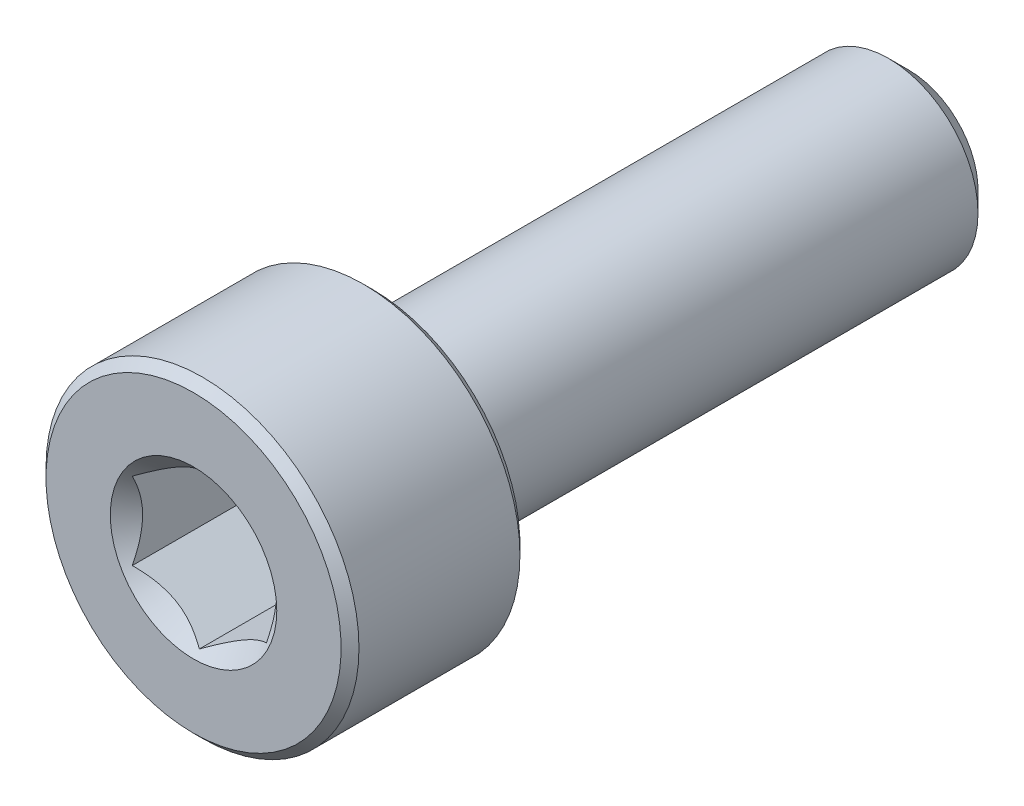
ISO-10303-21;
HEADER;
FILE_DESCRIPTION(('STEP AP214'),'2;1');
FILE_NAME('part.step','',(''),(''),'','','');
FILE_SCHEMA(('AUTOMOTIVE_DESIGN { 1 0 10303 214 1 1 1 1 }'));
ENDSEC;
DATA;
#1=APPLICATION_CONTEXT('core data for automotive mechanical design processes');
#2=APPLICATION_PROTOCOL_DEFINITION('international standard','automotive_design',2000,#1);
#3=PRODUCT_CONTEXT('',#1,'mechanical');
#4=PRODUCT('Part','Part','',(#3));
#5=PRODUCT_RELATED_PRODUCT_CATEGORY('part','',(#4));
#6=PRODUCT_DEFINITION_FORMATION('','',#4);
#7=PRODUCT_DEFINITION_CONTEXT('part definition',#1,'design');
#8=PRODUCT_DEFINITION('design','',#6,#7);
#9=PRODUCT_DEFINITION_SHAPE('','',#8);
#10=(LENGTH_UNIT() NAMED_UNIT(*) SI_UNIT(.MILLI.,.METRE.));
#11=(NAMED_UNIT(*) PLANE_ANGLE_UNIT() SI_UNIT($,.RADIAN.));
#12=(NAMED_UNIT(*) SI_UNIT($,.STERADIAN.) SOLID_ANGLE_UNIT());
#13=UNCERTAINTY_MEASURE_WITH_UNIT(LENGTH_MEASURE(1.E-05),#10,'distance_accuracy_value','');
#14=(GEOMETRIC_REPRESENTATION_CONTEXT(3) GLOBAL_UNCERTAINTY_ASSIGNED_CONTEXT((#13)) GLOBAL_UNIT_ASSIGNED_CONTEXT((#10,
#11,#12)) REPRESENTATION_CONTEXT('',''));
#15=CARTESIAN_POINT('',(0.,0.,0.));
#16=DIRECTION('',(0.,0.,1.));
#17=DIRECTION('',(1.,0.,0.));
#18=AXIS2_PLACEMENT_3D('',#15,#16,#17);
#19=CARTESIAN_POINT('',(0.,1.54533666301317,-8.));
#20=DIRECTION('',(0.,0.,-1.));
#21=DIRECTION('',(0.,1.,0.));
#22=AXIS2_PLACEMENT_3D('',#19,#20,#21);
#23=PLANE('',#22);
#24=CARTESIAN_POINT('',(0.,0.,-8.));
#25=DIRECTION('',(0.,0.,-1.));
#26=DIRECTION('',(0.,1.,0.));
#27=AXIS2_PLACEMENT_3D('',#24,#25,#26);
#28=CIRCLE('',#27,1.54533666301317);
#29=CARTESIAN_POINT('',(0.,1.54533666301317,-8.));
#30=VERTEX_POINT('',#29);
#31=EDGE_CURVE('E50',#30,#30,#28,.T.);
#32=ORIENTED_EDGE('',*,*,#31,.T.);
#33=EDGE_LOOP('',(#32));
#34=FACE_BOUND('',#33,.T.);
#35=ADVANCED_FACE('F37',(#34),#23,.T.);
#36=CARTESIAN_POINT('',(0.,0.,-8.));
#37=DIRECTION('',(0.,0.,1.));
#38=DIRECTION('',(0.,-1.,0.));
#39=AXIS2_PLACEMENT_3D('',#36,#37,#38);
#40=CONICAL_SURFACE('',#39,1.54533666301317,0.785398163397446);
#41=CARTESIAN_POINT('',(0.,0.,-7.54533666301317));
#42=DIRECTION('',(0.,0.,-1.));
#43=DIRECTION('',(0.,1.,0.));
#44=AXIS2_PLACEMENT_3D('',#41,#42,#43);
#45=CIRCLE('',#44,2.);
#46=CARTESIAN_POINT('',(0.,2.,-7.54533666301317));
#47=VERTEX_POINT('',#46);
#48=EDGE_CURVE('E153',#47,#47,#45,.T.);
#49=ORIENTED_EDGE('',*,*,#48,.T.);
#50=EDGE_LOOP('',(#49));
#51=FACE_BOUND('',#50,.T.);
#52=ORIENTED_EDGE('',*,*,#31,.F.);
#53=EDGE_LOOP('',(#52));
#54=FACE_BOUND('',#53,.T.);
#55=ADVANCED_FACE('F159',(#51,#54),#40,.T.);
#56=CARTESIAN_POINT('',(0.,0.,-8.));
#57=DIRECTION('',(0.,0.,-1.));
#58=DIRECTION('',(0.,1.,0.));
#59=AXIS2_PLACEMENT_3D('',#56,#57,#58);
#60=CYLINDRICAL_SURFACE('',#59,2.);
#61=CARTESIAN_POINT('',(0.,0.,3.8));
#62=DIRECTION('',(0.,0.,-1.));
#63=DIRECTION('',(0.,1.,0.));
#64=AXIS2_PLACEMENT_3D('',#61,#62,#63);
#65=CIRCLE('',#64,2.);
#66=CARTESIAN_POINT('',(0.,2.,3.8));
#67=VERTEX_POINT('',#66);
#68=EDGE_CURVE('E150',#67,#67,#65,.T.);
#69=ORIENTED_EDGE('',*,*,#68,.T.);
#70=EDGE_LOOP('',(#69));
#71=FACE_BOUND('',#70,.T.);
#72=ORIENTED_EDGE('',*,*,#48,.F.);
#73=EDGE_LOOP('',(#72));
#74=FACE_BOUND('',#73,.T.);
#75=ADVANCED_FACE('F161',(#71,#74),#60,.T.);
#76=CARTESIAN_POINT('',(0.,0.,3.8));
#77=DIRECTION('',(0.,0.,-1.));
#78=DIRECTION('',(0.,1.,0.));
#79=AXIS2_PLACEMENT_3D('',#76,#77,#78);
#80=TOROIDAL_SURFACE('',#79,2.2,0.200000000000001);
#81=CARTESIAN_POINT('',(0.,0.,4.));
#82=DIRECTION('',(0.,0.,-1.));
#83=DIRECTION('',(0.,1.,0.));
#84=AXIS2_PLACEMENT_3D('',#81,#82,#83);
#85=CIRCLE('',#84,2.2);
#86=CARTESIAN_POINT('',(0.,2.2,4.));
#87=VERTEX_POINT('',#86);
#88=EDGE_CURVE('E147',#87,#87,#85,.T.);
#89=ORIENTED_EDGE('',*,*,#88,.T.);
#90=EDGE_LOOP('',(#89));
#91=FACE_BOUND('',#90,.T.);
#92=ORIENTED_EDGE('',*,*,#68,.F.);
#93=EDGE_LOOP('',(#92));
#94=FACE_BOUND('',#93,.T.);
#95=ADVANCED_FACE('F167',(#91,#94),#80,.F.);
#96=CARTESIAN_POINT('',(0.,3.3,4.));
#97=DIRECTION('',(0.,0.,-1.));
#98=DIRECTION('',(0.,1.,0.));
#99=AXIS2_PLACEMENT_3D('',#96,#97,#98);
#100=PLANE('',#99);
#101=CARTESIAN_POINT('',(0.,0.,4.));
#102=DIRECTION('',(0.,0.,-1.));
#103=DIRECTION('',(0.,1.,0.));
#104=AXIS2_PLACEMENT_3D('',#101,#102,#103);
#105=CIRCLE('',#104,3.3);
#106=CARTESIAN_POINT('',(0.,3.3,4.));
#107=VERTEX_POINT('',#106);
#108=EDGE_CURVE('E144',#107,#107,#105,.T.);
#109=ORIENTED_EDGE('',*,*,#108,.T.);
#110=EDGE_LOOP('',(#109));
#111=FACE_BOUND('',#110,.T.);
#112=ORIENTED_EDGE('',*,*,#88,.F.);
#113=EDGE_LOOP('',(#112));
#114=FACE_BOUND('',#113,.T.);
#115=ADVANCED_FACE('F173',(#111,#114),#100,.T.);
#116=CARTESIAN_POINT('',(0.,0.,4.));
#117=DIRECTION('',(0.,0.,1.));
#118=DIRECTION('',(0.,-1.,0.));
#119=AXIS2_PLACEMENT_3D('',#116,#117,#118);
#120=CONICAL_SURFACE('',#119,3.3,0.785398163397452);
#121=CARTESIAN_POINT('',(0.,0.,4.2));
#122=DIRECTION('',(0.,0.,-1.));
#123=DIRECTION('',(0.,1.,0.));
#124=AXIS2_PLACEMENT_3D('',#121,#122,#123);
#125=CIRCLE('',#124,3.5);
#126=CARTESIAN_POINT('',(0.,3.5,4.2));
#127=VERTEX_POINT('',#126);
#128=EDGE_CURVE('E141',#127,#127,#125,.T.);
#129=ORIENTED_EDGE('',*,*,#128,.T.);
#130=EDGE_LOOP('',(#129));
#131=FACE_BOUND('',#130,.T.);
#132=ORIENTED_EDGE('',*,*,#108,.F.);
#133=EDGE_LOOP('',(#132));
#134=FACE_BOUND('',#133,.T.);
#135=ADVANCED_FACE('F177',(#131,#134),#120,.T.);
#136=CARTESIAN_POINT('',(0.,0.,-8.));
#137=DIRECTION('',(0.,0.,-1.));
#138=DIRECTION('',(0.,1.,0.));
#139=AXIS2_PLACEMENT_3D('',#136,#137,#138);
#140=CYLINDRICAL_SURFACE('',#139,3.5);
#141=CARTESIAN_POINT('',(0.,0.,7.8));
#142=DIRECTION('',(0.,0.,-1.));
#143=DIRECTION('',(0.,1.,0.));
#144=AXIS2_PLACEMENT_3D('',#141,#142,#143);
#145=CIRCLE('',#144,3.5);
#146=CARTESIAN_POINT('',(0.,3.5,7.8));
#147=VERTEX_POINT('',#146);
#148=EDGE_CURVE('E138',#147,#147,#145,.T.);
#149=ORIENTED_EDGE('',*,*,#148,.T.);
#150=EDGE_LOOP('',(#149));
#151=FACE_BOUND('',#150,.T.);
#152=ORIENTED_EDGE('',*,*,#128,.F.);
#153=EDGE_LOOP('',(#152));
#154=FACE_BOUND('',#153,.T.);
#155=ADVANCED_FACE('F181',(#151,#154),#140,.T.);
#156=CARTESIAN_POINT('',(0.,0.,7.8));
#157=DIRECTION('',(0.,0.,-1.));
#158=DIRECTION('',(0.,1.,0.));
#159=AXIS2_PLACEMENT_3D('',#156,#157,#158);
#160=CONICAL_SURFACE('',#159,3.5,0.785398163397452);
#161=CARTESIAN_POINT('',(0.,0.,8.));
#162=DIRECTION('',(0.,0.,-1.));
#163=DIRECTION('',(0.,1.,0.));
#164=AXIS2_PLACEMENT_3D('',#161,#162,#163);
#165=CIRCLE('',#164,3.3);
#166=CARTESIAN_POINT('',(0.,3.3,8.));
#167=VERTEX_POINT('',#166);
#168=EDGE_CURVE('E135',#167,#167,#165,.T.);
#169=ORIENTED_EDGE('',*,*,#168,.T.);
#170=EDGE_LOOP('',(#169));
#171=FACE_BOUND('',#170,.T.);
#172=ORIENTED_EDGE('',*,*,#148,.F.);
#173=EDGE_LOOP('',(#172));
#174=FACE_BOUND('',#173,.T.);
#175=ADVANCED_FACE('F185',(#171,#174),#160,.T.);
#176=CARTESIAN_POINT('',(0.,0.,8.));
#177=DIRECTION('',(0.,0.,1.));
#178=DIRECTION('',(0.,-1.,0.));
#179=AXIS2_PLACEMENT_3D('',#176,#177,#178);
#180=PLANE('',#179);
#181=CARTESIAN_POINT('',(0.,0.,8.));
#182=DIRECTION('',(0.,0.,1.));
#183=DIRECTION('',(1.,0.,0.));
#184=AXIS2_PLACEMENT_3D('',#181,#182,#183);
#185=CIRCLE('',#184,1.86195461813654);
#186=CARTESIAN_POINT('',(1.86195461813654,0.,8.));
#187=VERTEX_POINT('',#186);
#188=EDGE_CURVE('E109',#187,#187,#185,.T.);
#189=ORIENTED_EDGE('',*,*,#188,.F.);
#190=EDGE_LOOP('',(#189));
#191=FACE_BOUND('',#190,.T.);
#192=ORIENTED_EDGE('',*,*,#168,.F.);
#193=EDGE_LOOP('',(#192));
#194=FACE_BOUND('',#193,.T.);
#195=ADVANCED_FACE('F189',(#191,#194),#180,.T.);
#196=CARTESIAN_POINT('',(0.,0.,8.));
#197=DIRECTION('',(0.,0.,1.));
#198=DIRECTION('',(1.,0.,0.));
#199=AXIS2_PLACEMENT_3D('',#196,#197,#198);
#200=CONICAL_SURFACE('',#199,1.86195461813654,0.78539816339745);
#201=ORIENTED_EDGE('',*,*,#188,.T.);
#202=EDGE_LOOP('',(#201));
#203=FACE_BOUND('',#202,.T.);
#204=CARTESIAN_POINT('',(-0.000199999999999267,-1.73216627762272,7.87021167103241));
#205=CARTESIAN_POINT('',(0.0513677907370764,-1.70239359975915,7.84046166549966));
#206=CARTESIAN_POINT('',(0.103797917665202,-1.67212305186355,7.81245867334265));
#207=CARTESIAN_POINT('',(0.210709034055597,-1.61039789003619,7.76118541987248));
#208=CARTESIAN_POINT('',(0.265200195814662,-1.57893740312614,7.73794369447671));
#209=CARTESIAN_POINT('',(0.375079081357249,-1.51549879897987,7.69812991842456));
#210=CARTESIAN_POINT('',(0.4304388090952,-1.4835368452681,7.68145777510323));
#211=CARTESIAN_POINT('',(0.542377257477151,-1.41890915196211,7.65577064625044));
#212=CARTESIAN_POINT('',(0.598952556553009,-1.38624538781118,7.6467364799112));
#213=CARTESIAN_POINT('',(0.696455389516441,-1.32995210095299,7.63858527065919));
#214=CARTESIAN_POINT('',(0.737256908280467,-1.30639533311124,7.63737844242155));
#215=CARTESIAN_POINT('',(0.818787969615859,-1.25932335290193,7.6394102465946));
#216=CARTESIAN_POINT('',(0.859517494314631,-1.23580815085313,7.64264986018064));
#217=CARTESIAN_POINT('',(0.940584402163417,-1.18900414978427,7.6533881754143));
#218=CARTESIAN_POINT('',(0.980921384598289,-1.16571558211719,7.66089084245107));
#219=CARTESIAN_POINT('',(1.06091833691403,-1.11952932016335,7.67974780136063));
#220=CARTESIAN_POINT('',(1.10057800851621,-1.09663179808786,7.69110374645092));
#221=CARTESIAN_POINT('',(1.20216313477449,-1.03798159809698,7.72481783702501));
#222=CARTESIAN_POINT('',(1.26345855370969,-1.00259267147465,7.7497180385257));
#223=CARTESIAN_POINT('',(1.35358562846331,-0.950557780604374,7.79175284270391));
#224=CARTESIAN_POINT('',(1.38328513990772,-0.933410759677148,7.80652134299143));
#225=CARTESIAN_POINT('',(1.44213790138375,-0.899432101996407,7.8374067553725));
#226=CARTESIAN_POINT('',(1.47129140422064,-0.88260031928571,7.85352302355405));
#227=CARTESIAN_POINT('',(1.5002,-0.865909933730601,7.87021167103241));
#228=B_SPLINE_CURVE_WITH_KNOTS('',3,(#204,#205,#206,#207,#208,#209,#210,#211,#212,#213,#214,
#215,#216,#217,#218,#219,#220,#221,#222,#223,#224,#225,#226,#227),.UNSPECIFIED.,.F.,.F.,(4,2,2,
2,2,2,2,2,2,2,2,4),(0.,0.199829143693305,0.400822987382389,0.598623720538181,0.795926240188889,
0.937113067959881,1.07833105577193,1.21968061668222,1.36109089931054,1.58570969637565,
1.69770705470963,1.80965120737194),.UNSPECIFIED.);
#229=CARTESIAN_POINT('',(0.,-1.73205080756888,7.87009618943234));
#230=VERTEX_POINT('',#229);
#231=CARTESIAN_POINT('',(1.5,-0.866025403784439,7.87009618943233));
#232=VERTEX_POINT('',#231);
#233=EDGE_CURVE('E12',#230,#232,#228,.T.);
#234=ORIENTED_EDGE('',*,*,#233,.F.);
#235=CARTESIAN_POINT('',(-1.5002,-0.865909933730601,7.87021167103241));
#236=CARTESIAN_POINT('',(-1.44863220926292,-0.895682611594166,7.84046166549966));
#237=CARTESIAN_POINT('',(-1.3962020823348,-0.925953159489765,7.81245867334265));
#238=CARTESIAN_POINT('',(-1.2892909659444,-0.987678321317124,7.76118541987248));
#239=CARTESIAN_POINT('',(-1.23479980418534,-1.01913880822718,7.73794369447671));
#240=CARTESIAN_POINT('',(-1.12492091864275,-1.08257741237344,7.69812991842456));
#241=CARTESIAN_POINT('',(-1.0695611909048,-1.11453936608521,7.68145777510323));
#242=CARTESIAN_POINT('',(-0.957622742522849,-1.1791670593912,7.65577064625044));
#243=CARTESIAN_POINT('',(-0.901047443446991,-1.21183082354213,7.6467364799112));
#244=CARTESIAN_POINT('',(-0.803544610483559,-1.26812411040032,7.63858527065919));
#245=CARTESIAN_POINT('',(-0.762743091719534,-1.29168087824208,7.63737844242155));
#246=CARTESIAN_POINT('',(-0.681212030384142,-1.33875285845138,7.6394102465946));
#247=CARTESIAN_POINT('',(-0.64048250568537,-1.36226806050018,7.64264986018064));
#248=CARTESIAN_POINT('',(-0.559415597836584,-1.40907206156905,7.6533881754143));
#249=CARTESIAN_POINT('',(-0.519078615401712,-1.43236062923612,7.66089084245107));
#250=CARTESIAN_POINT('',(-0.439081663085969,-1.47854689118996,7.67974780136063));
#251=CARTESIAN_POINT('',(-0.399421991483792,-1.50144441326545,7.69110374645092));
#252=CARTESIAN_POINT('',(-0.297836865225515,-1.56009461325633,7.72481783702501));
#253=CARTESIAN_POINT('',(-0.236541446290311,-1.59548353987866,7.7497180385257));
#254=CARTESIAN_POINT('',(-0.146414371536687,-1.64751843074894,7.79175284270391));
#255=CARTESIAN_POINT('',(-0.116714860092283,-1.66466545167617,7.80652134299143));
#256=CARTESIAN_POINT('',(-0.0578620986162491,-1.69864410935691,7.8374067553725));
#257=CARTESIAN_POINT('',(-0.0287085957793627,-1.71547589206761,7.85352302355404));
#258=CARTESIAN_POINT('',(0.000200000000000315,-1.73216627762272,7.87021167103241));
#259=B_SPLINE_CURVE_WITH_KNOTS('',3,(#235,#236,#237,#238,#239,#240,#241,#242,#243,#244,#245,
#246,#247,#248,#249,#250,#251,#252,#253,#254,#255,#256,#257,#258),.UNSPECIFIED.,.F.,.F.,(4,2,2,
2,2,2,2,2,2,2,2,4),(0.,0.199829143693304,0.400822987382388,0.598623720538181,0.795926240188889,
0.937113067959881,1.07833105577193,1.21968061668222,1.36109089931054,1.58570969637565,
1.69770705470964,1.80965120737194),.UNSPECIFIED.);
#260=CARTESIAN_POINT('',(-1.5,-0.866025403784439,7.87009618943234));
#261=VERTEX_POINT('',#260);
#262=EDGE_CURVE('E95',#261,#230,#259,.T.);
#263=ORIENTED_EDGE('',*,*,#262,.F.);
#264=CARTESIAN_POINT('',(-1.5,-1.81798631684901,8.49496588290931));
#265=CARTESIAN_POINT('',(-1.5,-1.77410479833239,8.46112335419702));
#266=CARTESIAN_POINT('',(-1.5,-1.72998897047494,8.42758561768896));
#267=CARTESIAN_POINT('',(-1.5,-1.64119029432319,8.36124817349268));
#268=CARTESIAN_POINT('',(-1.5,-1.59650731534755,8.328448640911));
#269=CARTESIAN_POINT('',(-1.5,-1.460806940489,8.23088193148043));
#270=CARTESIAN_POINT('',(-1.5,-1.36880251235632,8.1674654206559));
#271=CARTESIAN_POINT('',(-1.5,-1.17526237686872,8.04210237172158));
#272=CARTESIAN_POINT('',(-1.5,-1.07349393006072,7.98051141536721));
#273=CARTESIAN_POINT('',(-1.5,-0.864764842560628,7.86725220599653));
#274=CARTESIAN_POINT('',(-1.5,-0.75782333444995,7.81555043950584));
#275=CARTESIAN_POINT('',(-1.5,-0.598146069886858,7.75227317361643));
#276=CARTESIAN_POINT('',(-1.5,-0.547969945491557,7.73427408399124));
#277=CARTESIAN_POINT('',(-1.5,-0.446326869364775,7.70229546522083));
#278=CARTESIAN_POINT('',(-1.5,-0.394859836419925,7.68831618966241));
#279=CARTESIAN_POINT('',(-1.5,-0.291848397493325,7.66536569037263));
#280=CARTESIAN_POINT('',(-1.5,-0.240324749628771,7.65630281543282));
#281=CARTESIAN_POINT('',(-1.5,-0.13662544851591,7.64337711521516));
#282=CARTESIAN_POINT('',(-1.5,-0.0844499362377799,7.6395131846234));
#283=CARTESIAN_POINT('',(-1.5,0.0176806967011133,7.63731961256892));
#284=CARTESIAN_POINT('',(-1.5,0.067630704511662,7.63875006923659));
#285=CARTESIAN_POINT('',(-1.5,0.167145477637761,7.64651331423855));
#286=CARTESIAN_POINT('',(-1.5,0.216710207908514,7.6528465433779));
#287=CARTESIAN_POINT('',(-1.5,0.315937150651983,7.67016271707146));
#288=CARTESIAN_POINT('',(-1.5,0.365584733694539,7.68122815181031));
#289=CARTESIAN_POINT('',(-1.5,0.46378160619877,7.70739349919908));
#290=CARTESIAN_POINT('',(-1.5,0.512330953840259,7.72249319758548));
#291=CARTESIAN_POINT('',(-1.5,0.661313023287691,7.77461385569168));
#292=CARTESIAN_POINT('',(-1.5,0.759720789706278,7.81740496304236));
#293=CARTESIAN_POINT('',(-1.5,0.951942669022771,7.91263883721007));
#294=CARTESIAN_POINT('',(-1.5,1.04573912191844,7.96511552648595));
#295=CARTESIAN_POINT('',(-1.5,1.22504153577549,8.0734783373155));
#296=CARTESIAN_POINT('',(-1.5,1.3107282773288,8.12906910554414));
#297=CARTESIAN_POINT('',(-1.5,1.43696960041027,8.21505045621636));
#298=CARTESIAN_POINT('',(-1.5,1.47850725450332,8.24402268297088));
#299=CARTESIAN_POINT('',(-1.5,1.56101250374723,8.30274488393776));
#300=CARTESIAN_POINT('',(-1.5,1.60198025290925,8.33249464151831));
#301=CARTESIAN_POINT('',(-1.5,1.64271029717086,8.36256715528604));
#302=B_SPLINE_CURVE_WITH_KNOTS('',3,(#264,#265,#266,#267,#268,#269,#270,#271,#272,#273,#274,
#275,#276,#277,#278,#279,#280,#281,#282,#283,#284,#285,#286,#287,#288,#289,#290,#291,#292,#293,
#294,#295,#296,#297,#298,#299,#300,#301),.UNSPECIFIED.,.F.,.F.,(4,2,2,2,2,2,2,2,2,2,2,2,2,2,2,2,
2,2,4),(0.,0.166243250325255,0.332525527595493,0.667617582874062,1.02421660314856,
1.37958485991001,1.53937185590113,1.69916892971772,1.85587466130012,2.01254707142443,
2.16220898927398,2.31188436469119,2.46428258498153,2.61667271286895,2.93766301623296,
3.25979964661299,3.56606529199603,3.71798989158865,3.86987260467919),.UNSPECIFIED.);
#303=CARTESIAN_POINT('',(-1.5,0.866025403784438,7.87009618943233));
#304=VERTEX_POINT('',#303);
#305=EDGE_CURVE('E108',#304,#261,#302,.F.);
#306=ORIENTED_EDGE('',*,*,#305,.F.);
#307=CARTESIAN_POINT('',(0.000199999999999471,1.73216627762272,7.87021167103241));
#308=CARTESIAN_POINT('',(-0.0513677907370761,1.70239359975915,7.84046166549966));
#309=CARTESIAN_POINT('',(-0.103797917665201,1.67212305186355,7.81245867334265));
#310=CARTESIAN_POINT('',(-0.210709034055597,1.61039789003619,7.76118541987248));
#311=CARTESIAN_POINT('',(-0.265200195814661,1.57893740312614,7.73794369447671));
#312=CARTESIAN_POINT('',(-0.375079081357249,1.51549879897987,7.69812991842456));
#313=CARTESIAN_POINT('',(-0.4304388090952,1.4835368452681,7.68145777510323));
#314=CARTESIAN_POINT('',(-0.542377257477151,1.41890915196211,7.65577064625044));
#315=CARTESIAN_POINT('',(-0.598952556553009,1.38624538781118,7.6467364799112));
#316=CARTESIAN_POINT('',(-0.696455389516441,1.32995210095299,7.63858527065919));
#317=CARTESIAN_POINT('',(-0.737256908280467,1.30639533311124,7.63737844242155));
#318=CARTESIAN_POINT('',(-0.818787969615859,1.25932335290193,7.6394102465946));
#319=CARTESIAN_POINT('',(-0.85951749431463,1.23580815085313,7.64264986018064));
#320=CARTESIAN_POINT('',(-0.940584402163416,1.18900414978427,7.6533881754143));
#321=CARTESIAN_POINT('',(-0.980921384598288,1.1657155821172,7.66089084245107));
#322=CARTESIAN_POINT('',(-1.06091833691403,1.11952932016335,7.67974780136063));
#323=CARTESIAN_POINT('',(-1.10057800851621,1.09663179808786,7.69110374645092));
#324=CARTESIAN_POINT('',(-1.20216313477449,1.03798159809698,7.72481783702501));
#325=CARTESIAN_POINT('',(-1.26345855370969,1.00259267147465,7.7497180385257));
#326=CARTESIAN_POINT('',(-1.35358562846331,0.950557780604375,7.79175284270391));
#327=CARTESIAN_POINT('',(-1.38328513990772,0.933410759677147,7.80652134299143));
#328=CARTESIAN_POINT('',(-1.44213790138375,0.899432101996407,7.8374067553725));
#329=CARTESIAN_POINT('',(-1.47129140422064,0.88260031928571,7.85352302355404));
#330=CARTESIAN_POINT('',(-1.5002,0.865909933730601,7.87021167103241));
#331=B_SPLINE_CURVE_WITH_KNOTS('',3,(#307,#308,#309,#310,#311,#312,#313,#314,#315,#316,#317,
#318,#319,#320,#321,#322,#323,#324,#325,#326,#327,#328,#329,#330),.UNSPECIFIED.,.F.,.F.,(4,2,2,
2,2,2,2,2,2,2,2,4),(0.,0.199829143693305,0.400822987382389,0.598623720538181,0.795926240188889,
0.937113067959881,1.07833105577193,1.21968061668222,1.36109089931054,1.58570969637565,
1.69770705470963,1.80965120737194),.UNSPECIFIED.);
#332=CARTESIAN_POINT('',(0.,1.73205080756888,7.87009618943234));
#333=VERTEX_POINT('',#332);
#334=EDGE_CURVE('E239',#333,#304,#331,.T.);
#335=ORIENTED_EDGE('',*,*,#334,.F.);
#336=CARTESIAN_POINT('',(1.5002,0.865909933730601,7.87021167103241));
#337=CARTESIAN_POINT('',(1.44863220926292,0.895682611594166,7.84046166549966));
#338=CARTESIAN_POINT('',(1.3962020823348,0.925953159489765,7.81245867334265));
#339=CARTESIAN_POINT('',(1.2892909659444,0.987678321317124,7.76118541987248));
#340=CARTESIAN_POINT('',(1.23479980418534,1.01913880822718,7.73794369447671));
#341=CARTESIAN_POINT('',(1.12492091864275,1.08257741237344,7.69812991842456));
#342=CARTESIAN_POINT('',(1.0695611909048,1.11453936608521,7.68145777510323));
#343=CARTESIAN_POINT('',(0.957622742522849,1.1791670593912,7.65577064625044));
#344=CARTESIAN_POINT('',(0.901047443446991,1.21183082354213,7.6467364799112));
#345=CARTESIAN_POINT('',(0.803544610483559,1.26812411040032,7.63858527065919));
#346=CARTESIAN_POINT('',(0.762743091719534,1.29168087824208,7.63737844242155));
#347=CARTESIAN_POINT('',(0.681212030384142,1.33875285845138,7.6394102465946));
#348=CARTESIAN_POINT('',(0.64048250568537,1.36226806050018,7.64264986018064));
#349=CARTESIAN_POINT('',(0.559415597836584,1.40907206156905,7.6533881754143));
#350=CARTESIAN_POINT('',(0.519078615401712,1.43236062923612,7.66089084245107));
#351=CARTESIAN_POINT('',(0.439081663085969,1.47854689118996,7.67974780136062));
#352=CARTESIAN_POINT('',(0.399421991483792,1.50144441326545,7.69110374645092));
#353=CARTESIAN_POINT('',(0.297836865225515,1.56009461325633,7.72481783702501));
#354=CARTESIAN_POINT('',(0.236541446290311,1.59548353987866,7.7497180385257));
#355=CARTESIAN_POINT('',(0.146414371536687,1.64751843074894,7.79175284270391));
#356=CARTESIAN_POINT('',(0.116714860092283,1.66466545167617,7.80652134299143));
#357=CARTESIAN_POINT('',(0.0578620986162498,1.69864410935691,7.8374067553725));
#358=CARTESIAN_POINT('',(0.0287085957793633,1.71547589206761,7.85352302355404));
#359=CARTESIAN_POINT('',(-0.000200000000000031,1.73216627762272,7.87021167103241));
#360=B_SPLINE_CURVE_WITH_KNOTS('',3,(#336,#337,#338,#339,#340,#341,#342,#343,#344,#345,#346,
#347,#348,#349,#350,#351,#352,#353,#354,#355,#356,#357,#358,#359),.UNSPECIFIED.,.F.,.F.,(4,2,2,
2,2,2,2,2,2,2,2,4),(0.,0.199829143693305,0.400822987382388,0.598623720538181,0.795926240188889,
0.937113067959881,1.07833105577193,1.21968061668222,1.36109089931054,1.58570969637565,
1.69770705470964,1.80965120737194),.UNSPECIFIED.);
#361=CARTESIAN_POINT('',(1.5,0.866025403784439,7.87009618943234));
#362=VERTEX_POINT('',#361);
#363=EDGE_CURVE('E212',#362,#333,#360,.T.);
#364=ORIENTED_EDGE('',*,*,#363,.F.);
#365=CARTESIAN_POINT('',(1.5,-1.81798631684901,8.49496588290931));
#366=CARTESIAN_POINT('',(1.5,-1.77410479833239,8.46112335419702));
#367=CARTESIAN_POINT('',(1.5,-1.72998897047494,8.42758561768896));
#368=CARTESIAN_POINT('',(1.5,-1.64119029432319,8.36124817349268));
#369=CARTESIAN_POINT('',(1.5,-1.59650731534755,8.328448640911));
#370=CARTESIAN_POINT('',(1.5,-1.460806940489,8.23088193148043));
#371=CARTESIAN_POINT('',(1.5,-1.36880251235632,8.1674654206559));
#372=CARTESIAN_POINT('',(1.5,-1.17526237686872,8.04210237172158));
#373=CARTESIAN_POINT('',(1.5,-1.07349393006072,7.98051141536721));
#374=CARTESIAN_POINT('',(1.5,-0.864764842560627,7.86725220599653));
#375=CARTESIAN_POINT('',(1.5,-0.757823334449949,7.81555043950584));
#376=CARTESIAN_POINT('',(1.5,-0.598146069886858,7.75227317361643));
#377=CARTESIAN_POINT('',(1.5,-0.547969945491557,7.73427408399124));
#378=CARTESIAN_POINT('',(1.5,-0.446326869364774,7.70229546522083));
#379=CARTESIAN_POINT('',(1.5,-0.394859836419925,7.68831618966241));
#380=CARTESIAN_POINT('',(1.5,-0.291848397493325,7.66536569037263));
#381=CARTESIAN_POINT('',(1.5,-0.240324749628771,7.65630281543282));
#382=CARTESIAN_POINT('',(1.5,-0.13662544851591,7.64337711521516));
#383=CARTESIAN_POINT('',(1.5,-0.08444993623778,7.6395131846234));
#384=CARTESIAN_POINT('',(1.5,0.0176806967011131,7.63731961256892));
#385=CARTESIAN_POINT('',(1.5,0.0676307045116619,7.63875006923659));
#386=CARTESIAN_POINT('',(1.5,0.16714547763776,7.64651331423855));
#387=CARTESIAN_POINT('',(1.5,0.216710207908513,7.6528465433779));
#388=CARTESIAN_POINT('',(1.5,0.315937150651982,7.67016271707146));
#389=CARTESIAN_POINT('',(1.5,0.365584733694538,7.68122815181031));
#390=CARTESIAN_POINT('',(1.5,0.463781606198769,7.70739349919908));
#391=CARTESIAN_POINT('',(1.5,0.512330953840259,7.72249319758548));
#392=CARTESIAN_POINT('',(1.5,0.66131302328769,7.77461385569168));
#393=CARTESIAN_POINT('',(1.5,0.759720789706277,7.81740496304236));
#394=CARTESIAN_POINT('',(1.5,0.95194266902277,7.91263883721007));
#395=CARTESIAN_POINT('',(1.5,1.04573912191844,7.96511552648595));
#396=CARTESIAN_POINT('',(1.5,1.22504153577549,8.0734783373155));
#397=CARTESIAN_POINT('',(1.5,1.3107282773288,8.12906910554414));
#398=CARTESIAN_POINT('',(1.5,1.43696960041027,8.21505045621636));
#399=CARTESIAN_POINT('',(1.5,1.47850725450332,8.24402268297088));
#400=CARTESIAN_POINT('',(1.5,1.56101250374723,8.30274488393776));
#401=CARTESIAN_POINT('',(1.5,1.60198025290925,8.33249464151831));
#402=CARTESIAN_POINT('',(1.5,1.64271029717086,8.36256715528604));
#403=B_SPLINE_CURVE_WITH_KNOTS('',3,(#365,#366,#367,#368,#369,#370,#371,#372,#373,#374,#375,
#376,#377,#378,#379,#380,#381,#382,#383,#384,#385,#386,#387,#388,#389,#390,#391,#392,#393,#394,
#395,#396,#397,#398,#399,#400,#401,#402),.UNSPECIFIED.,.F.,.F.,(4,2,2,2,2,2,2,2,2,2,2,2,2,2,2,2,
2,2,4),(0.,0.166243250325255,0.332525527595493,0.667617582874063,1.02421660314856,
1.37958485991002,1.53937185590113,1.69916892971772,1.85587466130012,2.01254707142443,
2.16220898927398,2.31188436469119,2.46428258498153,2.61667271286895,2.93766301623296,
3.25979964661299,3.56606529199602,3.71798989158865,3.86987260467919),.UNSPECIFIED.);
#404=EDGE_CURVE('E57',#232,#362,#403,.T.);
#405=ORIENTED_EDGE('',*,*,#404,.F.);
#406=EDGE_LOOP('',(#234,#263,#306,#335,#364,#405));
#407=FACE_BOUND('',#406,.T.);
#408=ADVANCED_FACE('F94',(#203,#407),#200,.F.);
#409=CARTESIAN_POINT('',(0.,3.3,5.));
#410=DIRECTION('',(0.,0.,-1.));
#411=DIRECTION('',(0.,1.,0.));
#412=AXIS2_PLACEMENT_3D('',#409,#410,#411);
#413=PLANE('',#412);
#414=DIRECTION('',(0.866025403784438,0.5,0.));
#415=VECTOR('',#414,1.);
#416=CARTESIAN_POINT('',(0.,-1.73205080756888,5.));
#417=LINE('',#416,#415);
#418=CARTESIAN_POINT('',(0.,-1.73205080756888,5.));
#419=VERTEX_POINT('',#418);
#420=CARTESIAN_POINT('',(1.5,-0.866025403784439,5.));
#421=VERTEX_POINT('',#420);
#422=EDGE_CURVE('E112',#419,#421,#417,.T.);
#423=ORIENTED_EDGE('',*,*,#422,.T.);
#424=DIRECTION('',(0.,1.,0.));
#425=VECTOR('',#424,1.);
#426=CARTESIAN_POINT('',(1.5,-0.866025403784439,5.));
#427=LINE('',#426,#425);
#428=CARTESIAN_POINT('',(1.5,0.866025403784439,5.));
#429=VERTEX_POINT('',#428);
#430=EDGE_CURVE('E64',#421,#429,#427,.T.);
#431=ORIENTED_EDGE('',*,*,#430,.T.);
#432=DIRECTION('',(-0.866025403784439,0.5,0.));
#433=VECTOR('',#432,1.);
#434=CARTESIAN_POINT('',(1.5,0.866025403784439,5.));
#435=LINE('',#434,#433);
#436=CARTESIAN_POINT('',(0.,1.73205080756888,5.));
#437=VERTEX_POINT('',#436);
#438=EDGE_CURVE('E120',#429,#437,#435,.T.);
#439=ORIENTED_EDGE('',*,*,#438,.T.);
#440=DIRECTION('',(-0.866025403784439,-0.5,0.));
#441=VECTOR('',#440,1.);
#442=CARTESIAN_POINT('',(0.,1.73205080756888,5.));
#443=LINE('',#442,#441);
#444=CARTESIAN_POINT('',(-1.5,0.866025403784439,5.));
#445=VERTEX_POINT('',#444);
#446=EDGE_CURVE('E127',#437,#445,#443,.T.);
#447=ORIENTED_EDGE('',*,*,#446,.T.);
#448=DIRECTION('',(0.,-1.,0.));
#449=VECTOR('',#448,1.);
#450=CARTESIAN_POINT('',(-1.5,0.866025403784438,5.));
#451=LINE('',#450,#449);
#452=CARTESIAN_POINT('',(-1.5,-0.866025403784439,5.));
#453=VERTEX_POINT('',#452);
#454=EDGE_CURVE('E123',#445,#453,#451,.T.);
#455=ORIENTED_EDGE('',*,*,#454,.T.);
#456=DIRECTION('',(0.866025403784439,-0.5,0.));
#457=VECTOR('',#456,1.);
#458=CARTESIAN_POINT('',(-1.5,-0.866025403784439,5.));
#459=LINE('',#458,#457);
#460=EDGE_CURVE('E113',#453,#419,#459,.T.);
#461=ORIENTED_EDGE('',*,*,#460,.T.);
#462=EDGE_LOOP('',(#423,#431,#439,#447,#455,#461));
#463=FACE_BOUND('',#462,.T.);
#464=ADVANCED_FACE('F194',(#463),#413,.F.);
#465=CARTESIAN_POINT('',(0.,-1.73205080756888,-0.582575694955841));
#466=DIRECTION('',(0.5,-0.866025403784438,0.));
#467=DIRECTION('',(0.866025403784438,0.5,0.));
#468=AXIS2_PLACEMENT_3D('',#465,#466,#467);
#469=PLANE('',#468);
#470=DIRECTION('',(0.,0.,1.));
#471=VECTOR('',#470,1.);
#472=CARTESIAN_POINT('',(0.,-1.73205080756888,-0.582575694955841));
#473=LINE('',#472,#471);
#474=EDGE_CURVE('E104',#419,#230,#473,.T.);
#475=ORIENTED_EDGE('',*,*,#474,.T.);
#476=ORIENTED_EDGE('',*,*,#233,.T.);
#477=DIRECTION('',(0.,0.,1.));
#478=VECTOR('',#477,1.);
#479=CARTESIAN_POINT('',(1.5,-0.866025403784439,-0.582575694955841));
#480=LINE('',#479,#478);
#481=EDGE_CURVE('E115',#421,#232,#480,.T.);
#482=ORIENTED_EDGE('',*,*,#481,.F.);
#483=ORIENTED_EDGE('',*,*,#422,.F.);
#484=EDGE_LOOP('',(#475,#476,#482,#483));
#485=FACE_BOUND('',#484,.T.);
#486=ADVANCED_FACE('F111',(#485),#469,.F.);
#487=CARTESIAN_POINT('',(-1.5,-0.866025403784439,-0.582575694955841));
#488=DIRECTION('',(-0.5,-0.866025403784439,0.));
#489=DIRECTION('',(0.866025403784439,-0.5,0.));
#490=AXIS2_PLACEMENT_3D('',#487,#488,#489);
#491=PLANE('',#490);
#492=DIRECTION('',(0.,0.,1.));
#493=VECTOR('',#492,1.);
#494=CARTESIAN_POINT('',(-1.5,-0.866025403784439,-0.582575694955841));
#495=LINE('',#494,#493);
#496=EDGE_CURVE('E107',#453,#261,#495,.T.);
#497=ORIENTED_EDGE('',*,*,#496,.T.);
#498=ORIENTED_EDGE('',*,*,#262,.T.);
#499=ORIENTED_EDGE('',*,*,#474,.F.);
#500=ORIENTED_EDGE('',*,*,#460,.F.);
#501=EDGE_LOOP('',(#497,#498,#499,#500));
#502=FACE_BOUND('',#501,.T.);
#503=ADVANCED_FACE('F103',(#502),#491,.F.);
#504=CARTESIAN_POINT('',(-1.5,0.866025403784438,-0.582575694955841));
#505=DIRECTION('',(-1.,0.,0.));
#506=DIRECTION('',(0.,0.,1.));
#507=AXIS2_PLACEMENT_3D('',#504,#505,#506);
#508=PLANE('',#507);
#509=DIRECTION('',(0.,0.,1.));
#510=VECTOR('',#509,1.);
#511=CARTESIAN_POINT('',(-1.5,0.866025403784438,-0.582575694955841));
#512=LINE('',#511,#510);
#513=EDGE_CURVE('E124',#445,#304,#512,.T.);
#514=ORIENTED_EDGE('',*,*,#513,.T.);
#515=ORIENTED_EDGE('',*,*,#305,.T.);
#516=ORIENTED_EDGE('',*,*,#496,.F.);
#517=ORIENTED_EDGE('',*,*,#454,.F.);
#518=EDGE_LOOP('',(#514,#515,#516,#517));
#519=FACE_BOUND('',#518,.T.);
#520=ADVANCED_FACE('F248',(#519),#508,.F.);
#521=CARTESIAN_POINT('',(0.,1.73205080756888,-0.582575694955841));
#522=DIRECTION('',(-0.5,0.866025403784438,0.));
#523=DIRECTION('',(-0.866025403784439,-0.5,0.));
#524=AXIS2_PLACEMENT_3D('',#521,#522,#523);
#525=PLANE('',#524);
#526=DIRECTION('',(0.,0.,1.));
#527=VECTOR('',#526,1.);
#528=CARTESIAN_POINT('',(0.,1.73205080756888,-0.582575694955841));
#529=LINE('',#528,#527);
#530=EDGE_CURVE('E128',#437,#333,#529,.T.);
#531=ORIENTED_EDGE('',*,*,#530,.T.);
#532=ORIENTED_EDGE('',*,*,#334,.T.);
#533=ORIENTED_EDGE('',*,*,#513,.F.);
#534=ORIENTED_EDGE('',*,*,#446,.F.);
#535=EDGE_LOOP('',(#531,#532,#533,#534));
#536=FACE_BOUND('',#535,.T.);
#537=ADVANCED_FACE('F245',(#536),#525,.F.);
#538=CARTESIAN_POINT('',(1.5,0.866025403784439,-0.582575694955841));
#539=DIRECTION('',(0.5,0.866025403784439,0.));
#540=DIRECTION('',(-0.866025403784439,0.5,0.));
#541=AXIS2_PLACEMENT_3D('',#538,#539,#540);
#542=PLANE('',#541);
#543=DIRECTION('',(0.,0.,1.));
#544=VECTOR('',#543,1.);
#545=CARTESIAN_POINT('',(1.5,0.866025403784439,-0.582575694955841));
#546=LINE('',#545,#544);
#547=EDGE_CURVE('E131',#429,#362,#546,.T.);
#548=ORIENTED_EDGE('',*,*,#547,.T.);
#549=ORIENTED_EDGE('',*,*,#363,.T.);
#550=ORIENTED_EDGE('',*,*,#530,.F.);
#551=ORIENTED_EDGE('',*,*,#438,.F.);
#552=EDGE_LOOP('',(#548,#549,#550,#551));
#553=FACE_BOUND('',#552,.T.);
#554=ADVANCED_FACE('F202',(#553),#542,.F.);
#555=CARTESIAN_POINT('',(1.5,-0.866025403784439,-0.582575694955841));
#556=DIRECTION('',(1.,0.,0.));
#557=DIRECTION('',(0.,0.,-1.));
#558=AXIS2_PLACEMENT_3D('',#555,#556,#557);
#559=PLANE('',#558);
#560=ORIENTED_EDGE('',*,*,#481,.T.);
#561=ORIENTED_EDGE('',*,*,#404,.T.);
#562=ORIENTED_EDGE('',*,*,#547,.F.);
#563=ORIENTED_EDGE('',*,*,#430,.F.);
#564=EDGE_LOOP('',(#560,#561,#562,#563));
#565=FACE_BOUND('',#564,.T.);
#566=ADVANCED_FACE('F198',(#565),#559,.F.);
#567=CLOSED_SHELL('',(#35,#55,#75,#95,#115,#135,#155,#175,#195,#408,#464,#486,#503,#520,#537,
#554,#566));
#568=MANIFOLD_SOLID_BREP('B2',#567);
#569=ADVANCED_BREP_SHAPE_REPRESENTATION('',(#18,#568),#14);
#570=SHAPE_DEFINITION_REPRESENTATION(#9,#569);
ENDSEC;
END-ISO-10303-21;
